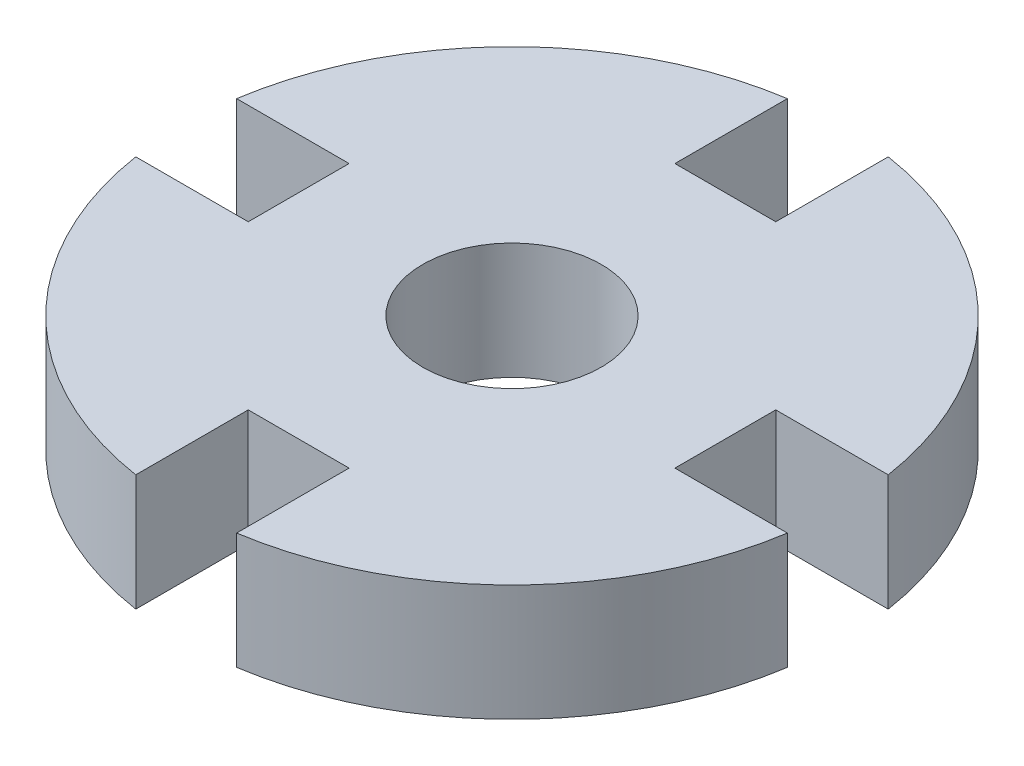
ISO-10303-21;
HEADER;
FILE_DESCRIPTION(('STEP AP214'),'2;1');
FILE_NAME('part.step','',(''),(''),'','','');
FILE_SCHEMA(('AUTOMOTIVE_DESIGN { 1 0 10303 214 1 1 1 1 }'));
ENDSEC;
DATA;
#1=APPLICATION_CONTEXT('core data for automotive mechanical design processes');
#2=APPLICATION_PROTOCOL_DEFINITION('international standard','automotive_design',2000,#1);
#3=PRODUCT_CONTEXT('',#1,'mechanical');
#4=PRODUCT('Part','Part','',(#3));
#5=PRODUCT_RELATED_PRODUCT_CATEGORY('part','',(#4));
#6=PRODUCT_DEFINITION_FORMATION('','',#4);
#7=PRODUCT_DEFINITION_CONTEXT('part definition',#1,'design');
#8=PRODUCT_DEFINITION('design','',#6,#7);
#9=PRODUCT_DEFINITION_SHAPE('','',#8);
#10=(LENGTH_UNIT() NAMED_UNIT(*) SI_UNIT(.MILLI.,.METRE.));
#11=(NAMED_UNIT(*) PLANE_ANGLE_UNIT() SI_UNIT($,.RADIAN.));
#12=(NAMED_UNIT(*) SI_UNIT($,.STERADIAN.) SOLID_ANGLE_UNIT());
#13=UNCERTAINTY_MEASURE_WITH_UNIT(LENGTH_MEASURE(1.E-05),#10,'distance_accuracy_value','');
#14=(GEOMETRIC_REPRESENTATION_CONTEXT(3) GLOBAL_UNCERTAINTY_ASSIGNED_CONTEXT((#13)) GLOBAL_UNIT_ASSIGNED_CONTEXT((#10,
#11,#12)) REPRESENTATION_CONTEXT('',''));
#15=CARTESIAN_POINT('',(0.,0.,0.));
#16=DIRECTION('',(0.,0.,1.));
#17=DIRECTION('',(1.,0.,0.));
#18=AXIS2_PLACEMENT_3D('',#15,#16,#17);
#19=CARTESIAN_POINT('',(0.,-1.5,0.));
#20=DIRECTION('',(0.,1.,0.));
#21=DIRECTION('',(0.,0.,1.));
#22=AXIS2_PLACEMENT_3D('',#19,#20,#21);
#23=CYLINDRICAL_SURFACE('',#22,8.5);
#24=DIRECTION('',(0.,1.,0.));
#25=VECTOR('',#24,1.);
#26=CARTESIAN_POINT('',(1.3,-1.5,8.4));
#27=LINE('',#26,#25);
#28=CARTESIAN_POINT('',(1.3,-1.5,8.4));
#29=VERTEX_POINT('',#28);
#30=CARTESIAN_POINT('',(1.3,1.5,8.4));
#31=VERTEX_POINT('',#30);
#32=EDGE_CURVE('E240',#29,#31,#27,.T.);
#33=ORIENTED_EDGE('',*,*,#32,.F.);
#34=CARTESIAN_POINT('',(0.,-1.5,0.));
#35=DIRECTION('',(0.,1.,0.));
#36=DIRECTION('',(0.,0.,1.));
#37=AXIS2_PLACEMENT_3D('',#34,#35,#36);
#38=CIRCLE('',#37,8.5);
#39=CARTESIAN_POINT('',(8.4,-1.5,1.3));
#40=VERTEX_POINT('',#39);
#41=EDGE_CURVE('E168',#29,#40,#38,.T.);
#42=ORIENTED_EDGE('',*,*,#41,.T.);
#43=DIRECTION('',(0.,1.,0.));
#44=VECTOR('',#43,1.);
#45=CARTESIAN_POINT('',(8.4,-1.5,1.3));
#46=LINE('',#45,#44);
#47=CARTESIAN_POINT('',(8.4,1.5,1.3));
#48=VERTEX_POINT('',#47);
#49=EDGE_CURVE('E178',#48,#40,#46,.F.);
#50=ORIENTED_EDGE('',*,*,#49,.F.);
#51=CARTESIAN_POINT('',(0.,1.5,0.));
#52=DIRECTION('',(0.,1.,0.));
#53=DIRECTION('',(0.,0.,1.));
#54=AXIS2_PLACEMENT_3D('',#51,#52,#53);
#55=CIRCLE('',#54,8.5);
#56=EDGE_CURVE('E251',#31,#48,#55,.T.);
#57=ORIENTED_EDGE('',*,*,#56,.F.);
#58=EDGE_LOOP('',(#33,#42,#50,#57));
#59=FACE_BOUND('',#58,.T.);
#60=ADVANCED_FACE('F33',(#59),#23,.T.);
#61=DIRECTION('',(0.,1.,0.));
#62=VECTOR('',#61,1.);
#63=CARTESIAN_POINT('',(-1.3,-1.5,8.4));
#64=LINE('',#63,#62);
#65=CARTESIAN_POINT('',(-1.3,1.5,8.4));
#66=VERTEX_POINT('',#65);
#67=CARTESIAN_POINT('',(-1.3,-1.5,8.4));
#68=VERTEX_POINT('',#67);
#69=EDGE_CURVE('E242',#66,#68,#64,.F.);
#70=ORIENTED_EDGE('',*,*,#69,.F.);
#71=CARTESIAN_POINT('',(-8.4,1.5,1.3));
#72=VERTEX_POINT('',#71);
#73=EDGE_CURVE('E247',#72,#66,#55,.T.);
#74=ORIENTED_EDGE('',*,*,#73,.F.);
#75=DIRECTION('',(0.,1.,0.));
#76=VECTOR('',#75,1.);
#77=CARTESIAN_POINT('',(-8.4,-1.5,1.3));
#78=LINE('',#77,#76);
#79=CARTESIAN_POINT('',(-8.4,-1.5,1.3));
#80=VERTEX_POINT('',#79);
#81=EDGE_CURVE('E238',#80,#72,#78,.T.);
#82=ORIENTED_EDGE('',*,*,#81,.F.);
#83=EDGE_CURVE('E255',#80,#68,#38,.T.);
#84=ORIENTED_EDGE('',*,*,#83,.T.);
#85=EDGE_LOOP('',(#70,#74,#82,#84));
#86=FACE_BOUND('',#85,.T.);
#87=ADVANCED_FACE('F301',(#86),#23,.T.);
#88=DIRECTION('',(0.,1.,0.));
#89=VECTOR('',#88,1.);
#90=CARTESIAN_POINT('',(-8.4,-1.5,-1.3));
#91=LINE('',#90,#89);
#92=CARTESIAN_POINT('',(-8.4,1.5,-1.3));
#93=VERTEX_POINT('',#92);
#94=CARTESIAN_POINT('',(-8.4,-1.5,-1.3));
#95=VERTEX_POINT('',#94);
#96=EDGE_CURVE('E236',#93,#95,#91,.F.);
#97=ORIENTED_EDGE('',*,*,#96,.F.);
#98=CARTESIAN_POINT('',(-1.3,1.5,-8.4));
#99=VERTEX_POINT('',#98);
#100=EDGE_CURVE('E250',#99,#93,#55,.T.);
#101=ORIENTED_EDGE('',*,*,#100,.F.);
#102=DIRECTION('',(0.,1.,0.));
#103=VECTOR('',#102,1.);
#104=CARTESIAN_POINT('',(-1.3,-1.5,-8.4));
#105=LINE('',#104,#103);
#106=CARTESIAN_POINT('',(-1.3,-1.5,-8.4));
#107=VERTEX_POINT('',#106);
#108=EDGE_CURVE('E234',#107,#99,#105,.T.);
#109=ORIENTED_EDGE('',*,*,#108,.F.);
#110=EDGE_CURVE('E258',#107,#95,#38,.T.);
#111=ORIENTED_EDGE('',*,*,#110,.T.);
#112=EDGE_LOOP('',(#97,#101,#109,#111));
#113=FACE_BOUND('',#112,.T.);
#114=ADVANCED_FACE('F283',(#113),#23,.T.);
#115=DIRECTION('',(0.,1.,0.));
#116=VECTOR('',#115,1.);
#117=CARTESIAN_POINT('',(1.3,-1.5,-8.4));
#118=LINE('',#117,#116);
#119=CARTESIAN_POINT('',(1.3,1.5,-8.4));
#120=VERTEX_POINT('',#119);
#121=CARTESIAN_POINT('',(1.3,-1.5,-8.4));
#122=VERTEX_POINT('',#121);
#123=EDGE_CURVE('E232',#120,#122,#118,.F.);
#124=ORIENTED_EDGE('',*,*,#123,.F.);
#125=CARTESIAN_POINT('',(8.4,1.5,-1.3));
#126=VERTEX_POINT('',#125);
#127=EDGE_CURVE('E319',#126,#120,#55,.T.);
#128=ORIENTED_EDGE('',*,*,#127,.F.);
#129=DIRECTION('',(0.,1.,0.));
#130=VECTOR('',#129,1.);
#131=CARTESIAN_POINT('',(8.4,-1.5,-1.3));
#132=LINE('',#131,#130);
#133=CARTESIAN_POINT('',(8.4,-1.5,-1.3));
#134=VERTEX_POINT('',#133);
#135=EDGE_CURVE('E230',#134,#126,#132,.T.);
#136=ORIENTED_EDGE('',*,*,#135,.F.);
#137=EDGE_CURVE('E286',#134,#122,#38,.T.);
#138=ORIENTED_EDGE('',*,*,#137,.T.);
#139=EDGE_LOOP('',(#124,#128,#136,#138));
#140=FACE_BOUND('',#139,.T.);
#141=ADVANCED_FACE('F308',(#140),#23,.T.);
#142=CARTESIAN_POINT('',(0.,-1.5,0.));
#143=DIRECTION('',(0.,1.,0.));
#144=DIRECTION('',(0.,0.,1.));
#145=AXIS2_PLACEMENT_3D('',#142,#143,#144);
#146=PLANE('',#145);
#147=CARTESIAN_POINT('',(0.,-1.5,0.));
#148=DIRECTION('',(0.,1.,0.));
#149=DIRECTION('',(0.,0.,1.));
#150=AXIS2_PLACEMENT_3D('',#147,#148,#149);
#151=CIRCLE('',#150,2.3);
#152=CARTESIAN_POINT('',(0.,-1.5,2.3));
#153=VERTEX_POINT('',#152);
#154=EDGE_CURVE('E252',#153,#153,#151,.T.);
#155=ORIENTED_EDGE('',*,*,#154,.T.);
#156=EDGE_LOOP('',(#155));
#157=FACE_BOUND('',#156,.T.);
#158=DIRECTION('',(-1.,0.,0.));
#159=VECTOR('',#158,1.);
#160=CARTESIAN_POINT('',(1.3,-1.5,5.5));
#161=LINE('',#160,#159);
#162=CARTESIAN_POINT('',(1.3,-1.5,5.5));
#163=VERTEX_POINT('',#162);
#164=CARTESIAN_POINT('',(-1.3,-1.5,5.5));
#165=VERTEX_POINT('',#164);
#166=EDGE_CURVE('E156',#163,#165,#161,.T.);
#167=ORIENTED_EDGE('',*,*,#166,.T.);
#168=DIRECTION('',(0.,0.,1.));
#169=VECTOR('',#168,1.);
#170=CARTESIAN_POINT('',(-1.3,-1.5,8.5));
#171=LINE('',#170,#169);
#172=EDGE_CURVE('E169',#165,#68,#171,.T.);
#173=ORIENTED_EDGE('',*,*,#172,.T.);
#174=ORIENTED_EDGE('',*,*,#83,.F.);
#175=DIRECTION('',(1.,0.,0.));
#176=VECTOR('',#175,1.);
#177=CARTESIAN_POINT('',(-8.5,-1.5,1.3));
#178=LINE('',#177,#176);
#179=CARTESIAN_POINT('',(-5.5,-1.5,1.3));
#180=VERTEX_POINT('',#179);
#181=EDGE_CURVE('E187',#80,#180,#178,.T.);
#182=ORIENTED_EDGE('',*,*,#181,.T.);
#183=DIRECTION('',(0.,0.,-1.));
#184=VECTOR('',#183,1.);
#185=CARTESIAN_POINT('',(-5.5,-1.5,1.3));
#186=LINE('',#185,#184);
#187=CARTESIAN_POINT('',(-5.5,-1.5,-1.3));
#188=VERTEX_POINT('',#187);
#189=EDGE_CURVE('E180',#180,#188,#186,.T.);
#190=ORIENTED_EDGE('',*,*,#189,.T.);
#191=DIRECTION('',(-1.,0.,0.));
#192=VECTOR('',#191,1.);
#193=CARTESIAN_POINT('',(-8.5,-1.5,-1.3));
#194=LINE('',#193,#192);
#195=EDGE_CURVE('E183',#188,#95,#194,.T.);
#196=ORIENTED_EDGE('',*,*,#195,.T.);
#197=ORIENTED_EDGE('',*,*,#110,.F.);
#198=DIRECTION('',(0.,0.,1.));
#199=VECTOR('',#198,1.);
#200=CARTESIAN_POINT('',(-1.3,-1.5,-8.5));
#201=LINE('',#200,#199);
#202=CARTESIAN_POINT('',(-1.3,-1.5,-5.5));
#203=VERTEX_POINT('',#202);
#204=EDGE_CURVE('E203',#107,#203,#201,.T.);
#205=ORIENTED_EDGE('',*,*,#204,.T.);
#206=DIRECTION('',(1.,0.,0.));
#207=VECTOR('',#206,1.);
#208=CARTESIAN_POINT('',(-1.3,-1.5,-5.5));
#209=LINE('',#208,#207);
#210=CARTESIAN_POINT('',(1.3,-1.5,-5.5));
#211=VERTEX_POINT('',#210);
#212=EDGE_CURVE('E196',#203,#211,#209,.T.);
#213=ORIENTED_EDGE('',*,*,#212,.T.);
#214=DIRECTION('',(0.,0.,-1.));
#215=VECTOR('',#214,1.);
#216=CARTESIAN_POINT('',(1.3,-1.5,-8.5));
#217=LINE('',#216,#215);
#218=EDGE_CURVE('E199',#211,#122,#217,.T.);
#219=ORIENTED_EDGE('',*,*,#218,.T.);
#220=ORIENTED_EDGE('',*,*,#137,.F.);
#221=DIRECTION('',(-1.,0.,0.));
#222=VECTOR('',#221,1.);
#223=CARTESIAN_POINT('',(8.5,-1.5,-1.3));
#224=LINE('',#223,#222);
#225=CARTESIAN_POINT('',(5.5,-1.5,-1.3));
#226=VERTEX_POINT('',#225);
#227=EDGE_CURVE('E218',#134,#226,#224,.T.);
#228=ORIENTED_EDGE('',*,*,#227,.T.);
#229=DIRECTION('',(0.,0.,1.));
#230=VECTOR('',#229,1.);
#231=CARTESIAN_POINT('',(5.5,-1.5,-1.3));
#232=LINE('',#231,#230);
#233=CARTESIAN_POINT('',(5.5,-1.5,1.3));
#234=VERTEX_POINT('',#233);
#235=EDGE_CURVE('E212',#226,#234,#232,.T.);
#236=ORIENTED_EDGE('',*,*,#235,.T.);
#237=DIRECTION('',(1.,0.,0.));
#238=VECTOR('',#237,1.);
#239=CARTESIAN_POINT('',(8.5,-1.5,1.3));
#240=LINE('',#239,#238);
#241=EDGE_CURVE('E215',#234,#40,#240,.T.);
#242=ORIENTED_EDGE('',*,*,#241,.T.);
#243=ORIENTED_EDGE('',*,*,#41,.F.);
#244=DIRECTION('',(0.,0.,-1.));
#245=VECTOR('',#244,1.);
#246=CARTESIAN_POINT('',(1.3,-1.5,8.5));
#247=LINE('',#246,#245);
#248=EDGE_CURVE('E149',#29,#163,#247,.T.);
#249=ORIENTED_EDGE('',*,*,#248,.T.);
#250=EDGE_LOOP('',(#167,#173,#174,#182,#190,#196,#197,#205,#213,#219,#220,#228,#236,#242,#243,#249));
#251=FACE_BOUND('',#250,.T.);
#252=ADVANCED_FACE('F165',(#157,#251),#146,.F.);
#253=CARTESIAN_POINT('',(0.,-1.5,0.));
#254=DIRECTION('',(0.,1.,0.));
#255=DIRECTION('',(0.,0.,1.));
#256=AXIS2_PLACEMENT_3D('',#253,#254,#255);
#257=CYLINDRICAL_SURFACE('',#256,2.3);
#258=ORIENTED_EDGE('',*,*,#154,.F.);
#259=EDGE_LOOP('',(#258));
#260=FACE_BOUND('',#259,.T.);
#261=CARTESIAN_POINT('',(0.,1.5,0.));
#262=DIRECTION('',(0.,1.,0.));
#263=DIRECTION('',(0.,0.,1.));
#264=AXIS2_PLACEMENT_3D('',#261,#262,#263);
#265=CIRCLE('',#264,2.3);
#266=CARTESIAN_POINT('',(0.,1.5,2.3));
#267=VERTEX_POINT('',#266);
#268=EDGE_CURVE('E244',#267,#267,#265,.T.);
#269=ORIENTED_EDGE('',*,*,#268,.T.);
#270=EDGE_LOOP('',(#269));
#271=FACE_BOUND('',#270,.T.);
#272=ADVANCED_FACE('F315',(#260,#271),#257,.F.);
#273=CARTESIAN_POINT('',(0.,1.5,0.));
#274=DIRECTION('',(0.,1.,0.));
#275=DIRECTION('',(0.,0.,1.));
#276=AXIS2_PLACEMENT_3D('',#273,#274,#275);
#277=PLANE('',#276);
#278=DIRECTION('',(0.,0.,1.));
#279=VECTOR('',#278,1.);
#280=CARTESIAN_POINT('',(-1.3,1.5,8.5));
#281=LINE('',#280,#279);
#282=CARTESIAN_POINT('',(-1.3,1.5,5.5));
#283=VERTEX_POINT('',#282);
#284=EDGE_CURVE('E174',#283,#66,#281,.T.);
#285=ORIENTED_EDGE('',*,*,#284,.F.);
#286=DIRECTION('',(-1.,0.,0.));
#287=VECTOR('',#286,1.);
#288=CARTESIAN_POINT('',(1.3,1.5,5.5));
#289=LINE('',#288,#287);
#290=CARTESIAN_POINT('',(1.3,1.5,5.5));
#291=VERTEX_POINT('',#290);
#292=EDGE_CURVE('E171',#291,#283,#289,.T.);
#293=ORIENTED_EDGE('',*,*,#292,.F.);
#294=DIRECTION('',(0.,0.,-1.));
#295=VECTOR('',#294,1.);
#296=CARTESIAN_POINT('',(1.3,1.5,0.));
#297=LINE('',#296,#295);
#298=EDGE_CURVE('E11',#31,#291,#297,.T.);
#299=ORIENTED_EDGE('',*,*,#298,.F.);
#300=ORIENTED_EDGE('',*,*,#56,.T.);
#301=DIRECTION('',(1.,0.,0.));
#302=VECTOR('',#301,1.);
#303=CARTESIAN_POINT('',(8.5,1.5,1.3));
#304=LINE('',#303,#302);
#305=CARTESIAN_POINT('',(5.5,1.5,1.3));
#306=VERTEX_POINT('',#305);
#307=EDGE_CURVE('E216',#306,#48,#304,.T.);
#308=ORIENTED_EDGE('',*,*,#307,.F.);
#309=DIRECTION('',(0.,0.,1.));
#310=VECTOR('',#309,1.);
#311=CARTESIAN_POINT('',(5.5,1.5,-1.3));
#312=LINE('',#311,#310);
#313=CARTESIAN_POINT('',(5.5,1.5,-1.3));
#314=VERTEX_POINT('',#313);
#315=EDGE_CURVE('E222',#314,#306,#312,.T.);
#316=ORIENTED_EDGE('',*,*,#315,.F.);
#317=DIRECTION('',(-1.,0.,0.));
#318=VECTOR('',#317,1.);
#319=CARTESIAN_POINT('',(0.,1.5,-1.3));
#320=LINE('',#319,#318);
#321=EDGE_CURVE('E259',#126,#314,#320,.T.);
#322=ORIENTED_EDGE('',*,*,#321,.F.);
#323=ORIENTED_EDGE('',*,*,#127,.T.);
#324=DIRECTION('',(0.,0.,-1.));
#325=VECTOR('',#324,1.);
#326=CARTESIAN_POINT('',(1.3,1.5,-8.5));
#327=LINE('',#326,#325);
#328=CARTESIAN_POINT('',(1.3,1.5,-5.5));
#329=VERTEX_POINT('',#328);
#330=EDGE_CURVE('E200',#329,#120,#327,.T.);
#331=ORIENTED_EDGE('',*,*,#330,.F.);
#332=DIRECTION('',(1.,0.,0.));
#333=VECTOR('',#332,1.);
#334=CARTESIAN_POINT('',(-1.3,1.5,-5.5));
#335=LINE('',#334,#333);
#336=CARTESIAN_POINT('',(-1.3,1.5,-5.5));
#337=VERTEX_POINT('',#336);
#338=EDGE_CURVE('E55',#337,#329,#335,.T.);
#339=ORIENTED_EDGE('',*,*,#338,.F.);
#340=DIRECTION('',(0.,0.,1.));
#341=VECTOR('',#340,1.);
#342=CARTESIAN_POINT('',(-1.3,1.5,0.));
#343=LINE('',#342,#341);
#344=EDGE_CURVE('E261',#99,#337,#343,.T.);
#345=ORIENTED_EDGE('',*,*,#344,.F.);
#346=ORIENTED_EDGE('',*,*,#100,.T.);
#347=DIRECTION('',(-1.,0.,0.));
#348=VECTOR('',#347,1.);
#349=CARTESIAN_POINT('',(-8.5,1.5,-1.3));
#350=LINE('',#349,#348);
#351=CARTESIAN_POINT('',(-5.5,1.5,-1.3));
#352=VERTEX_POINT('',#351);
#353=EDGE_CURVE('E184',#352,#93,#350,.T.);
#354=ORIENTED_EDGE('',*,*,#353,.F.);
#355=DIRECTION('',(0.,0.,-1.));
#356=VECTOR('',#355,1.);
#357=CARTESIAN_POINT('',(-5.5,1.5,1.3));
#358=LINE('',#357,#356);
#359=CARTESIAN_POINT('',(-5.5,1.5,1.3));
#360=VERTEX_POINT('',#359);
#361=EDGE_CURVE('E47',#360,#352,#358,.T.);
#362=ORIENTED_EDGE('',*,*,#361,.F.);
#363=DIRECTION('',(1.,0.,0.));
#364=VECTOR('',#363,1.);
#365=CARTESIAN_POINT('',(0.,1.5,1.3));
#366=LINE('',#365,#364);
#367=EDGE_CURVE('E40',#72,#360,#366,.T.);
#368=ORIENTED_EDGE('',*,*,#367,.F.);
#369=ORIENTED_EDGE('',*,*,#73,.T.);
#370=EDGE_LOOP('',(#285,#293,#299,#300,#308,#316,#322,#323,#331,#339,#345,#346,#354,#362,#368,#369));
#371=FACE_BOUND('',#370,.T.);
#372=ORIENTED_EDGE('',*,*,#268,.F.);
#373=EDGE_LOOP('',(#372));
#374=FACE_BOUND('',#373,.T.);
#375=ADVANCED_FACE('F272',(#371,#374),#277,.T.);
#376=CARTESIAN_POINT('',(5.5,-1.5,-1.3));
#377=DIRECTION('',(-1.,0.,0.));
#378=DIRECTION('',(0.,0.,1.));
#379=AXIS2_PLACEMENT_3D('',#376,#377,#378);
#380=PLANE('',#379);
#381=ORIENTED_EDGE('',*,*,#315,.T.);
#382=DIRECTION('',(0.,1.,0.));
#383=VECTOR('',#382,1.);
#384=CARTESIAN_POINT('',(5.5,-1.5,1.3));
#385=LINE('',#384,#383);
#386=EDGE_CURVE('E221',#234,#306,#385,.T.);
#387=ORIENTED_EDGE('',*,*,#386,.F.);
#388=ORIENTED_EDGE('',*,*,#235,.F.);
#389=DIRECTION('',(0.,1.,0.));
#390=VECTOR('',#389,1.);
#391=CARTESIAN_POINT('',(5.5,-1.5,-1.3));
#392=LINE('',#391,#390);
#393=EDGE_CURVE('E208',#226,#314,#392,.T.);
#394=ORIENTED_EDGE('',*,*,#393,.T.);
#395=EDGE_LOOP('',(#381,#387,#388,#394));
#396=FACE_BOUND('',#395,.T.);
#397=ADVANCED_FACE('F329',(#396),#380,.F.);
#398=CARTESIAN_POINT('',(8.5,-1.5,-1.3));
#399=DIRECTION('',(0.,0.,-1.));
#400=DIRECTION('',(-1.,0.,0.));
#401=AXIS2_PLACEMENT_3D('',#398,#399,#400);
#402=PLANE('',#401);
#403=ORIENTED_EDGE('',*,*,#135,.T.);
#404=ORIENTED_EDGE('',*,*,#321,.T.);
#405=ORIENTED_EDGE('',*,*,#393,.F.);
#406=ORIENTED_EDGE('',*,*,#227,.F.);
#407=EDGE_LOOP('',(#403,#404,#405,#406));
#408=FACE_BOUND('',#407,.T.);
#409=ADVANCED_FACE('F326',(#408),#402,.F.);
#410=CARTESIAN_POINT('',(8.5,-1.5,1.3));
#411=DIRECTION('',(0.,0.,1.));
#412=DIRECTION('',(1.,0.,0.));
#413=AXIS2_PLACEMENT_3D('',#410,#411,#412);
#414=PLANE('',#413);
#415=ORIENTED_EDGE('',*,*,#49,.T.);
#416=ORIENTED_EDGE('',*,*,#241,.F.);
#417=ORIENTED_EDGE('',*,*,#386,.T.);
#418=ORIENTED_EDGE('',*,*,#307,.T.);
#419=EDGE_LOOP('',(#415,#416,#417,#418));
#420=FACE_BOUND('',#419,.T.);
#421=ADVANCED_FACE('F343',(#420),#414,.F.);
#422=CARTESIAN_POINT('',(-1.3,-1.5,-5.5));
#423=DIRECTION('',(0.,0.,1.));
#424=DIRECTION('',(1.,0.,0.));
#425=AXIS2_PLACEMENT_3D('',#422,#423,#424);
#426=PLANE('',#425);
#427=ORIENTED_EDGE('',*,*,#338,.T.);
#428=DIRECTION('',(0.,1.,0.));
#429=VECTOR('',#428,1.);
#430=CARTESIAN_POINT('',(1.3,-1.5,-5.5));
#431=LINE('',#430,#429);
#432=EDGE_CURVE('E206',#211,#329,#431,.T.);
#433=ORIENTED_EDGE('',*,*,#432,.F.);
#434=ORIENTED_EDGE('',*,*,#212,.F.);
#435=DIRECTION('',(0.,1.,0.));
#436=VECTOR('',#435,1.);
#437=CARTESIAN_POINT('',(-1.3,-1.5,-5.5));
#438=LINE('',#437,#436);
#439=EDGE_CURVE('E192',#203,#337,#438,.T.);
#440=ORIENTED_EDGE('',*,*,#439,.T.);
#441=EDGE_LOOP('',(#427,#433,#434,#440));
#442=FACE_BOUND('',#441,.T.);
#443=ADVANCED_FACE('F333',(#442),#426,.F.);
#444=CARTESIAN_POINT('',(-1.3,-1.5,-8.5));
#445=DIRECTION('',(-1.,0.,0.));
#446=DIRECTION('',(0.,0.,1.));
#447=AXIS2_PLACEMENT_3D('',#444,#445,#446);
#448=PLANE('',#447);
#449=ORIENTED_EDGE('',*,*,#108,.T.);
#450=ORIENTED_EDGE('',*,*,#344,.T.);
#451=ORIENTED_EDGE('',*,*,#439,.F.);
#452=ORIENTED_EDGE('',*,*,#204,.F.);
#453=EDGE_LOOP('',(#449,#450,#451,#452));
#454=FACE_BOUND('',#453,.T.);
#455=ADVANCED_FACE('F335',(#454),#448,.F.);
#456=CARTESIAN_POINT('',(1.3,-1.5,-8.5));
#457=DIRECTION('',(1.,0.,0.));
#458=DIRECTION('',(0.,0.,-1.));
#459=AXIS2_PLACEMENT_3D('',#456,#457,#458);
#460=PLANE('',#459);
#461=ORIENTED_EDGE('',*,*,#123,.T.);
#462=ORIENTED_EDGE('',*,*,#218,.F.);
#463=ORIENTED_EDGE('',*,*,#432,.T.);
#464=ORIENTED_EDGE('',*,*,#330,.T.);
#465=EDGE_LOOP('',(#461,#462,#463,#464));
#466=FACE_BOUND('',#465,.T.);
#467=ADVANCED_FACE('F332',(#466),#460,.F.);
#468=CARTESIAN_POINT('',(-5.5,-1.5,1.3));
#469=DIRECTION('',(1.,0.,0.));
#470=DIRECTION('',(0.,0.,-1.));
#471=AXIS2_PLACEMENT_3D('',#468,#469,#470);
#472=PLANE('',#471);
#473=ORIENTED_EDGE('',*,*,#361,.T.);
#474=DIRECTION('',(0.,1.,0.));
#475=VECTOR('',#474,1.);
#476=CARTESIAN_POINT('',(-5.5,-1.5,-1.3));
#477=LINE('',#476,#475);
#478=EDGE_CURVE('E190',#188,#352,#477,.T.);
#479=ORIENTED_EDGE('',*,*,#478,.F.);
#480=ORIENTED_EDGE('',*,*,#189,.F.);
#481=DIRECTION('',(0.,1.,0.));
#482=VECTOR('',#481,1.);
#483=CARTESIAN_POINT('',(-5.5,-1.5,1.3));
#484=LINE('',#483,#482);
#485=EDGE_CURVE('E176',#180,#360,#484,.T.);
#486=ORIENTED_EDGE('',*,*,#485,.T.);
#487=EDGE_LOOP('',(#473,#479,#480,#486));
#488=FACE_BOUND('',#487,.T.);
#489=ADVANCED_FACE('F269',(#488),#472,.F.);
#490=CARTESIAN_POINT('',(-8.5,-1.5,1.3));
#491=DIRECTION('',(0.,0.,1.));
#492=DIRECTION('',(1.,0.,0.));
#493=AXIS2_PLACEMENT_3D('',#490,#491,#492);
#494=PLANE('',#493);
#495=ORIENTED_EDGE('',*,*,#81,.T.);
#496=ORIENTED_EDGE('',*,*,#367,.T.);
#497=ORIENTED_EDGE('',*,*,#485,.F.);
#498=ORIENTED_EDGE('',*,*,#181,.F.);
#499=EDGE_LOOP('',(#495,#496,#497,#498));
#500=FACE_BOUND('',#499,.T.);
#501=ADVANCED_FACE('F264',(#500),#494,.F.);
#502=CARTESIAN_POINT('',(-8.5,-1.5,-1.3));
#503=DIRECTION('',(0.,0.,-1.));
#504=DIRECTION('',(-1.,0.,0.));
#505=AXIS2_PLACEMENT_3D('',#502,#503,#504);
#506=PLANE('',#505);
#507=ORIENTED_EDGE('',*,*,#96,.T.);
#508=ORIENTED_EDGE('',*,*,#195,.F.);
#509=ORIENTED_EDGE('',*,*,#478,.T.);
#510=ORIENTED_EDGE('',*,*,#353,.T.);
#511=EDGE_LOOP('',(#507,#508,#509,#510));
#512=FACE_BOUND('',#511,.T.);
#513=ADVANCED_FACE('F279',(#512),#506,.F.);
#514=CARTESIAN_POINT('',(-1.3,-1.5,8.5));
#515=DIRECTION('',(-1.,0.,0.));
#516=DIRECTION('',(0.,0.,1.));
#517=AXIS2_PLACEMENT_3D('',#514,#515,#516);
#518=PLANE('',#517);
#519=ORIENTED_EDGE('',*,*,#69,.T.);
#520=ORIENTED_EDGE('',*,*,#172,.F.);
#521=DIRECTION('',(0.,1.,0.));
#522=VECTOR('',#521,1.);
#523=CARTESIAN_POINT('',(-1.3,-1.5,5.5));
#524=LINE('',#523,#522);
#525=EDGE_CURVE('E155',#165,#283,#524,.T.);
#526=ORIENTED_EDGE('',*,*,#525,.T.);
#527=ORIENTED_EDGE('',*,*,#284,.T.);
#528=EDGE_LOOP('',(#519,#520,#526,#527));
#529=FACE_BOUND('',#528,.T.);
#530=ADVANCED_FACE('F299',(#529),#518,.F.);
#531=CARTESIAN_POINT('',(1.3,-1.5,5.5));
#532=DIRECTION('',(0.,0.,-1.));
#533=DIRECTION('',(-1.,0.,0.));
#534=AXIS2_PLACEMENT_3D('',#531,#532,#533);
#535=PLANE('',#534);
#536=ORIENTED_EDGE('',*,*,#292,.T.);
#537=ORIENTED_EDGE('',*,*,#525,.F.);
#538=ORIENTED_EDGE('',*,*,#166,.F.);
#539=DIRECTION('',(0.,1.,0.));
#540=VECTOR('',#539,1.);
#541=CARTESIAN_POINT('',(1.3,-1.5,5.5));
#542=LINE('',#541,#540);
#543=EDGE_CURVE('E145',#163,#291,#542,.T.);
#544=ORIENTED_EDGE('',*,*,#543,.T.);
#545=EDGE_LOOP('',(#536,#537,#538,#544));
#546=FACE_BOUND('',#545,.T.);
#547=ADVANCED_FACE('F159',(#546),#535,.F.);
#548=CARTESIAN_POINT('',(1.3,-1.5,8.5));
#549=DIRECTION('',(1.,0.,0.));
#550=DIRECTION('',(0.,0.,-1.));
#551=AXIS2_PLACEMENT_3D('',#548,#549,#550);
#552=PLANE('',#551);
#553=ORIENTED_EDGE('',*,*,#32,.T.);
#554=ORIENTED_EDGE('',*,*,#298,.T.);
#555=ORIENTED_EDGE('',*,*,#543,.F.);
#556=ORIENTED_EDGE('',*,*,#248,.F.);
#557=EDGE_LOOP('',(#553,#554,#555,#556));
#558=FACE_BOUND('',#557,.T.);
#559=ADVANCED_FACE('F147',(#558),#552,.F.);
#560=CLOSED_SHELL('',(#60,#87,#114,#141,#252,#272,#375,#397,#409,#421,#443,#455,#467,#489,#501,
#513,#530,#547,#559));
#561=MANIFOLD_SOLID_BREP('B2',#560);
#562=ADVANCED_BREP_SHAPE_REPRESENTATION('',(#18,#561),#14);
#563=SHAPE_DEFINITION_REPRESENTATION(#9,#562);
ENDSEC;
END-ISO-10303-21;
